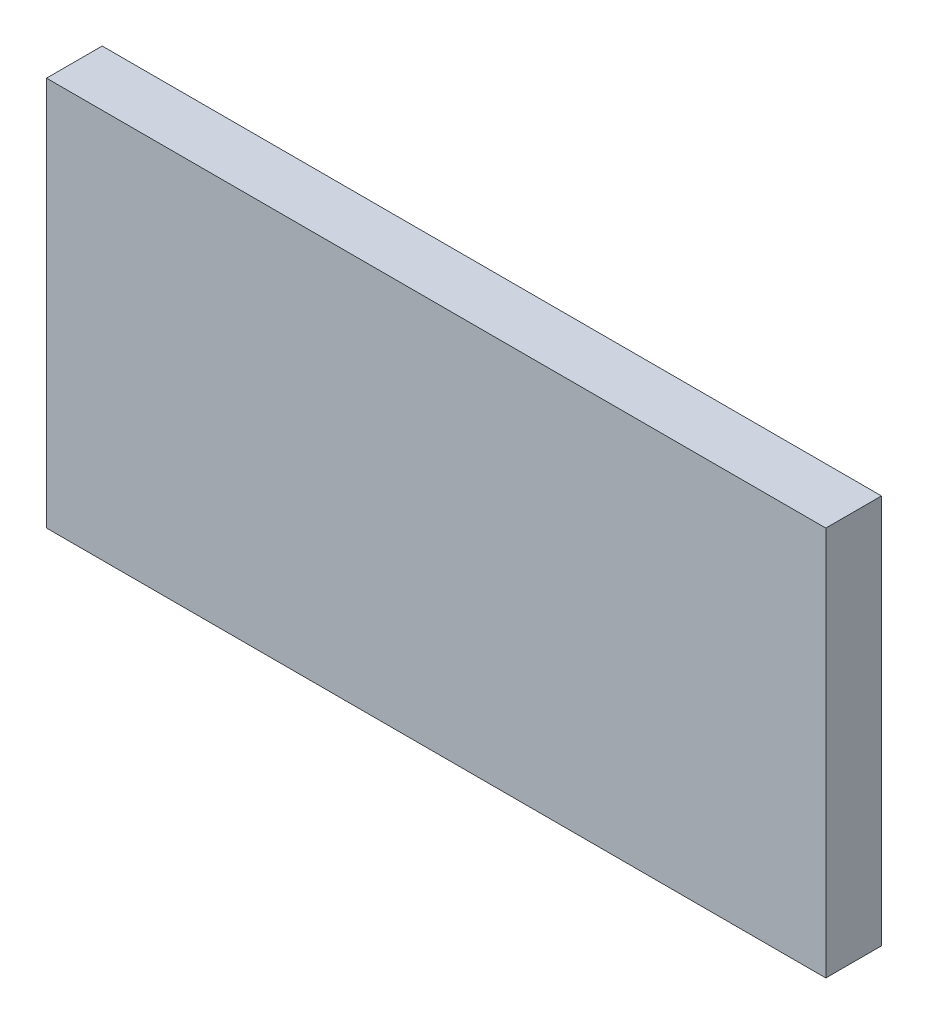
ISO-10303-21;
HEADER;
FILE_DESCRIPTION(('STEP AP214'),'2;1');
FILE_NAME('part.step','',(''),(''),'','','');
FILE_SCHEMA(('AUTOMOTIVE_DESIGN { 1 0 10303 214 1 1 1 1 }'));
ENDSEC;
DATA;
#1=APPLICATION_CONTEXT('core data for automotive mechanical design processes');
#2=APPLICATION_PROTOCOL_DEFINITION('international standard','automotive_design',2000,#1);
#3=PRODUCT_CONTEXT('',#1,'mechanical');
#4=PRODUCT('Part','Part','',(#3));
#5=PRODUCT_RELATED_PRODUCT_CATEGORY('part','',(#4));
#6=PRODUCT_DEFINITION_FORMATION('','',#4);
#7=PRODUCT_DEFINITION_CONTEXT('part definition',#1,'design');
#8=PRODUCT_DEFINITION('design','',#6,#7);
#9=PRODUCT_DEFINITION_SHAPE('','',#8);
#10=(LENGTH_UNIT() NAMED_UNIT(*) SI_UNIT(.MILLI.,.METRE.));
#11=(NAMED_UNIT(*) PLANE_ANGLE_UNIT() SI_UNIT($,.RADIAN.));
#12=(NAMED_UNIT(*) SI_UNIT($,.STERADIAN.) SOLID_ANGLE_UNIT());
#13=UNCERTAINTY_MEASURE_WITH_UNIT(LENGTH_MEASURE(1.E-05),#10,'distance_accuracy_value','');
#14=(GEOMETRIC_REPRESENTATION_CONTEXT(3) GLOBAL_UNCERTAINTY_ASSIGNED_CONTEXT((#13)) GLOBAL_UNIT_ASSIGNED_CONTEXT((#10,
#11,#12)) REPRESENTATION_CONTEXT('',''));
#15=CARTESIAN_POINT('',(0.,0.,0.));
#16=DIRECTION('',(0.,0.,1.));
#17=DIRECTION('',(1.,0.,0.));
#18=AXIS2_PLACEMENT_3D('',#15,#16,#17);
#19=CARTESIAN_POINT('',(17.78,-8.89,2.54));
#20=DIRECTION('',(-1.,0.,0.));
#21=DIRECTION('',(0.,0.,1.));
#22=AXIS2_PLACEMENT_3D('',#19,#20,#21);
#23=PLANE('',#22);
#24=DIRECTION('',(0.,1.,0.));
#25=VECTOR('',#24,1.);
#26=CARTESIAN_POINT('',(17.78,-8.89,0.));
#27=LINE('',#26,#25);
#28=CARTESIAN_POINT('',(17.78,-8.89,0.));
#29=VERTEX_POINT('',#28);
#30=CARTESIAN_POINT('',(17.78,8.89,0.));
#31=VERTEX_POINT('',#30);
#32=EDGE_CURVE('E96',#29,#31,#27,.T.);
#33=ORIENTED_EDGE('',*,*,#32,.T.);
#34=DIRECTION('',(0.,0.,-1.));
#35=VECTOR('',#34,1.);
#36=CARTESIAN_POINT('',(17.78,8.89,2.54));
#37=LINE('',#36,#35);
#38=CARTESIAN_POINT('',(17.78,8.89,2.54));
#39=VERTEX_POINT('',#38);
#40=EDGE_CURVE('E11',#39,#31,#37,.T.);
#41=ORIENTED_EDGE('',*,*,#40,.F.);
#42=DIRECTION('',(0.,1.,0.));
#43=VECTOR('',#42,1.);
#44=CARTESIAN_POINT('',(17.78,-8.89,2.54));
#45=LINE('',#44,#43);
#46=CARTESIAN_POINT('',(17.78,-8.89,2.54));
#47=VERTEX_POINT('',#46);
#48=EDGE_CURVE('E84',#47,#39,#45,.T.);
#49=ORIENTED_EDGE('',*,*,#48,.F.);
#50=DIRECTION('',(0.,0.,-1.));
#51=VECTOR('',#50,1.);
#52=CARTESIAN_POINT('',(17.78,-8.89,2.54));
#53=LINE('',#52,#51);
#54=EDGE_CURVE('E92',#47,#29,#53,.T.);
#55=ORIENTED_EDGE('',*,*,#54,.T.);
#56=EDGE_LOOP('',(#33,#41,#49,#55));
#57=FACE_BOUND('',#56,.T.);
#58=ADVANCED_FACE('F33',(#57),#23,.F.);
#59=CARTESIAN_POINT('',(-17.78,8.89,2.54));
#60=DIRECTION('',(0.,-1.,0.));
#61=DIRECTION('',(0.,0.,-1.));
#62=AXIS2_PLACEMENT_3D('',#59,#60,#61);
#63=PLANE('',#62);
#64=DIRECTION('',(-1.,0.,0.));
#65=VECTOR('',#64,1.);
#66=CARTESIAN_POINT('',(-17.78,8.89,0.));
#67=LINE('',#66,#65);
#68=CARTESIAN_POINT('',(-17.78,8.89,0.));
#69=VERTEX_POINT('',#68);
#70=EDGE_CURVE('E88',#31,#69,#67,.T.);
#71=ORIENTED_EDGE('',*,*,#70,.T.);
#72=DIRECTION('',(0.,0.,-1.));
#73=VECTOR('',#72,1.);
#74=CARTESIAN_POINT('',(-17.78,8.89,2.54));
#75=LINE('',#74,#73);
#76=CARTESIAN_POINT('',(-17.78,8.89,2.54));
#77=VERTEX_POINT('',#76);
#78=EDGE_CURVE('E41',#77,#69,#75,.T.);
#79=ORIENTED_EDGE('',*,*,#78,.F.);
#80=DIRECTION('',(-1.,0.,0.));
#81=VECTOR('',#80,1.);
#82=CARTESIAN_POINT('',(-17.78,8.89,2.54));
#83=LINE('',#82,#81);
#84=EDGE_CURVE('E79',#39,#77,#83,.T.);
#85=ORIENTED_EDGE('',*,*,#84,.F.);
#86=ORIENTED_EDGE('',*,*,#40,.T.);
#87=EDGE_LOOP('',(#71,#79,#85,#86));
#88=FACE_BOUND('',#87,.T.);
#89=ADVANCED_FACE('F87',(#88),#63,.F.);
#90=CARTESIAN_POINT('',(-17.78,-8.89,2.54));
#91=DIRECTION('',(1.,0.,0.));
#92=DIRECTION('',(0.,0.,-1.));
#93=AXIS2_PLACEMENT_3D('',#90,#91,#92);
#94=PLANE('',#93);
#95=DIRECTION('',(0.,-1.,0.));
#96=VECTOR('',#95,1.);
#97=CARTESIAN_POINT('',(-17.78,-8.89,0.));
#98=LINE('',#97,#96);
#99=CARTESIAN_POINT('',(-17.78,-8.89,0.));
#100=VERTEX_POINT('',#99);
#101=EDGE_CURVE('E66',#69,#100,#98,.T.);
#102=ORIENTED_EDGE('',*,*,#101,.T.);
#103=DIRECTION('',(0.,0.,-1.));
#104=VECTOR('',#103,1.);
#105=CARTESIAN_POINT('',(-17.78,-8.89,2.54));
#106=LINE('',#105,#104);
#107=CARTESIAN_POINT('',(-17.78,-8.89,2.54));
#108=VERTEX_POINT('',#107);
#109=EDGE_CURVE('E89',#108,#100,#106,.T.);
#110=ORIENTED_EDGE('',*,*,#109,.F.);
#111=DIRECTION('',(0.,-1.,0.));
#112=VECTOR('',#111,1.);
#113=CARTESIAN_POINT('',(-17.78,-8.89,2.54));
#114=LINE('',#113,#112);
#115=EDGE_CURVE('E82',#77,#108,#114,.T.);
#116=ORIENTED_EDGE('',*,*,#115,.F.);
#117=ORIENTED_EDGE('',*,*,#78,.T.);
#118=EDGE_LOOP('',(#102,#110,#116,#117));
#119=FACE_BOUND('',#118,.T.);
#120=ADVANCED_FACE('F90',(#119),#94,.F.);
#121=CARTESIAN_POINT('',(-17.78,-8.89,2.54));
#122=DIRECTION('',(0.,1.,0.));
#123=DIRECTION('',(0.,0.,1.));
#124=AXIS2_PLACEMENT_3D('',#121,#122,#123);
#125=PLANE('',#124);
#126=DIRECTION('',(1.,0.,0.));
#127=VECTOR('',#126,1.);
#128=CARTESIAN_POINT('',(-17.78,-8.89,0.));
#129=LINE('',#128,#127);
#130=EDGE_CURVE('E72',#100,#29,#129,.T.);
#131=ORIENTED_EDGE('',*,*,#130,.T.);
#132=ORIENTED_EDGE('',*,*,#54,.F.);
#133=DIRECTION('',(1.,0.,0.));
#134=VECTOR('',#133,1.);
#135=CARTESIAN_POINT('',(-17.78,-8.89,2.54));
#136=LINE('',#135,#134);
#137=EDGE_CURVE('E49',#108,#47,#136,.T.);
#138=ORIENTED_EDGE('',*,*,#137,.F.);
#139=ORIENTED_EDGE('',*,*,#109,.T.);
#140=EDGE_LOOP('',(#131,#132,#138,#139));
#141=FACE_BOUND('',#140,.T.);
#142=ADVANCED_FACE('F103',(#141),#125,.F.);
#143=CARTESIAN_POINT('',(0.,0.,2.54));
#144=DIRECTION('',(0.,0.,-1.));
#145=DIRECTION('',(-1.,0.,0.));
#146=AXIS2_PLACEMENT_3D('',#143,#144,#145);
#147=PLANE('',#146);
#148=ORIENTED_EDGE('',*,*,#48,.T.);
#149=ORIENTED_EDGE('',*,*,#84,.T.);
#150=ORIENTED_EDGE('',*,*,#115,.T.);
#151=ORIENTED_EDGE('',*,*,#137,.T.);
#152=EDGE_LOOP('',(#148,#149,#150,#151));
#153=FACE_BOUND('',#152,.T.);
#154=ADVANCED_FACE('F80',(#153),#147,.F.);
#155=CARTESIAN_POINT('',(0.,0.,0.));
#156=DIRECTION('',(0.,0.,-1.));
#157=DIRECTION('',(-1.,0.,0.));
#158=AXIS2_PLACEMENT_3D('',#155,#156,#157);
#159=PLANE('',#158);
#160=ORIENTED_EDGE('',*,*,#32,.F.);
#161=ORIENTED_EDGE('',*,*,#130,.F.);
#162=ORIENTED_EDGE('',*,*,#101,.F.);
#163=ORIENTED_EDGE('',*,*,#70,.F.);
#164=EDGE_LOOP('',(#160,#161,#162,#163));
#165=FACE_BOUND('',#164,.T.);
#166=ADVANCED_FACE('F106',(#165),#159,.T.);
#167=CLOSED_SHELL('',(#58,#89,#120,#142,#154,#166));
#168=MANIFOLD_SOLID_BREP('B2',#167);
#169=ADVANCED_BREP_SHAPE_REPRESENTATION('',(#18,#168),#14);
#170=SHAPE_DEFINITION_REPRESENTATION(#9,#169);
ENDSEC;
END-ISO-10303-21;
